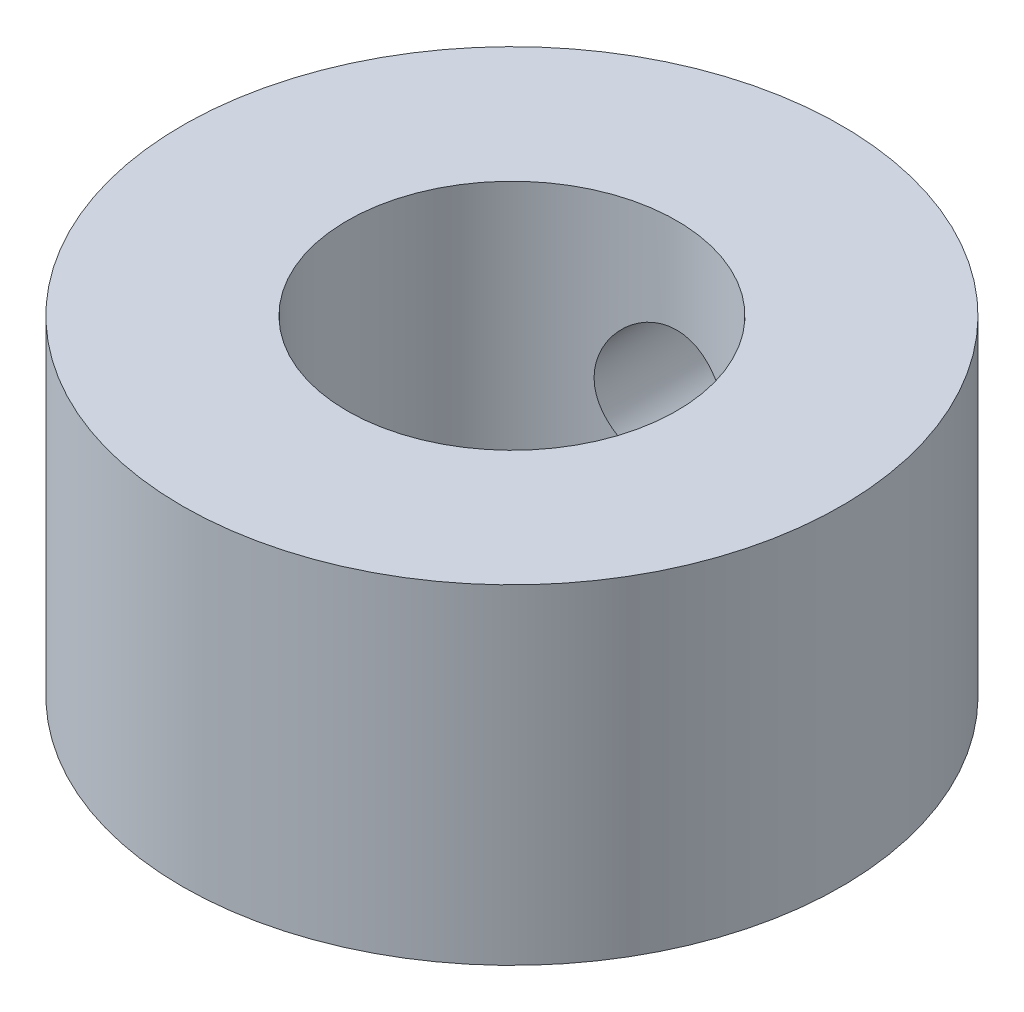
ISO-10303-21;
HEADER;
FILE_DESCRIPTION(('STEP AP214'),'2;1');
FILE_NAME('part.step','',(''),(''),'','','');
FILE_SCHEMA(('AUTOMOTIVE_DESIGN { 1 0 10303 214 1 1 1 1 }'));
ENDSEC;
DATA;
#1=APPLICATION_CONTEXT('core data for automotive mechanical design processes');
#2=APPLICATION_PROTOCOL_DEFINITION('international standard','automotive_design',2000,#1);
#3=PRODUCT_CONTEXT('',#1,'mechanical');
#4=PRODUCT('Part','Part','',(#3));
#5=PRODUCT_RELATED_PRODUCT_CATEGORY('part','',(#4));
#6=PRODUCT_DEFINITION_FORMATION('','',#4);
#7=PRODUCT_DEFINITION_CONTEXT('part definition',#1,'design');
#8=PRODUCT_DEFINITION('design','',#6,#7);
#9=PRODUCT_DEFINITION_SHAPE('','',#8);
#10=(LENGTH_UNIT() NAMED_UNIT(*) SI_UNIT(.MILLI.,.METRE.));
#11=(NAMED_UNIT(*) PLANE_ANGLE_UNIT() SI_UNIT($,.RADIAN.));
#12=(NAMED_UNIT(*) SI_UNIT($,.STERADIAN.) SOLID_ANGLE_UNIT());
#13=UNCERTAINTY_MEASURE_WITH_UNIT(LENGTH_MEASURE(1.E-05),#10,'distance_accuracy_value','');
#14=(GEOMETRIC_REPRESENTATION_CONTEXT(3) GLOBAL_UNCERTAINTY_ASSIGNED_CONTEXT((#13)) GLOBAL_UNIT_ASSIGNED_CONTEXT((#10,
#11,#12)) REPRESENTATION_CONTEXT('',''));
#15=CARTESIAN_POINT('',(0.,0.,0.));
#16=DIRECTION('',(0.,0.,1.));
#17=DIRECTION('',(1.,0.,0.));
#18=AXIS2_PLACEMENT_3D('',#15,#16,#17);
#19=CARTESIAN_POINT('',(0.,0.,0.));
#20=DIRECTION('',(0.,1.,0.));
#21=DIRECTION('',(0.,0.,1.));
#22=AXIS2_PLACEMENT_3D('',#19,#20,#21);
#23=CYLINDRICAL_SURFACE('',#22,4.);
#24=CARTESIAN_POINT('',(0.,0.,0.));
#25=DIRECTION('',(0.,1.,0.));
#26=DIRECTION('',(0.,0.,1.));
#27=AXIS2_PLACEMENT_3D('',#24,#25,#26);
#28=CIRCLE('',#27,4.);
#29=CARTESIAN_POINT('',(0.,0.,4.));
#30=VERTEX_POINT('',#29);
#31=EDGE_CURVE('E38',#30,#30,#28,.F.);
#32=ORIENTED_EDGE('',*,*,#31,.T.);
#33=EDGE_LOOP('',(#32));
#34=FACE_BOUND('',#33,.T.);
#35=CARTESIAN_POINT('',(0.,8.,0.));
#36=DIRECTION('',(0.,1.,0.));
#37=DIRECTION('',(0.,0.,1.));
#38=AXIS2_PLACEMENT_3D('',#35,#36,#37);
#39=CIRCLE('',#38,4.);
#40=CARTESIAN_POINT('',(0.,8.,4.));
#41=VERTEX_POINT('',#40);
#42=EDGE_CURVE('E61',#41,#41,#39,.F.);
#43=ORIENTED_EDGE('',*,*,#42,.F.);
#44=EDGE_LOOP('',(#43));
#45=FACE_BOUND('',#44,.T.);
#46=CARTESIAN_POINT('',(-1.65,4.05034929513931,-3.64383040220041));
#47=CARTESIAN_POINT('',(-1.64999056813102,4.13844577536499,-3.64383945275153));
#48=CARTESIAN_POINT('',(-1.64289989177358,4.2266897271129,-3.64707173267573));
#49=CARTESIAN_POINT('',(-1.61480845546373,4.40063635621819,-3.65959209124688));
#50=CARTESIAN_POINT('',(-1.5937695789634,4.48633139573691,-3.66889676295874));
#51=CARTESIAN_POINT('',(-1.53873536249638,4.65235223326994,-3.69231325052125));
#52=CARTESIAN_POINT('',(-1.50479212400174,4.73269811535791,-3.70640571161012));
#53=CARTESIAN_POINT('',(-1.42506535594207,4.88653106197353,-3.73778230052357));
#54=CARTESIAN_POINT('',(-1.37928479159595,4.96001983792334,-3.75506562873473));
#55=CARTESIAN_POINT('',(-1.27419856290372,5.10257798298581,-3.7920553041855));
#56=CARTESIAN_POINT('',(-1.2142851824136,5.17117855091952,-3.81184277704779));
#57=CARTESIAN_POINT('',(-1.08391072165483,5.29770406704807,-3.85094363418238));
#58=CARTESIAN_POINT('',(-1.01344563996364,5.35562494661153,-3.87025683535296));
#59=CARTESIAN_POINT('',(-0.860301943593383,5.46152066644118,-3.90721575035942));
#60=CARTESIAN_POINT('',(-0.777232390113591,5.50897022784547,-3.92475616703248));
#61=CARTESIAN_POINT('',(-0.603436361875857,5.58901944046101,-3.95520283117798));
#62=CARTESIAN_POINT('',(-0.512713242513045,5.62162555948587,-3.96811109652272));
#63=CARTESIAN_POINT('',(-0.331105172304398,5.66937000179554,-3.98726403378776));
#64=CARTESIAN_POINT('',(-0.240465625184492,5.68531614306255,-3.99381564337609));
#65=CARTESIAN_POINT('',(-0.057576355149865,5.70189594699448,-4.0006306156112));
#66=CARTESIAN_POINT('',(0.0346727137709554,5.70253569046132,-4.00089647540932));
#67=CARTESIAN_POINT('',(0.212297380895985,5.68891279900272,-3.99529224160632));
#68=CARTESIAN_POINT('',(0.297754665400397,5.67553711142221,-3.98978733384658));
#69=CARTESIAN_POINT('',(0.465085845235279,5.63578047769155,-3.97375926025944));
#70=CARTESIAN_POINT('',(0.546959476205493,5.60939857384863,-3.96323572489496));
#71=CARTESIAN_POINT('',(0.70629560681723,5.54406163341913,-3.93798907731603));
#72=CARTESIAN_POINT('',(0.78367197976247,5.50492130521444,-3.92320447216362));
#73=CARTESIAN_POINT('',(0.930960489992467,5.41535801595271,-3.89088763760773));
#74=CARTESIAN_POINT('',(1.00086999453932,5.36493109463601,-3.87335444442336));
#75=CARTESIAN_POINT('',(1.13638530947041,5.25016105611068,-3.83587133640027));
#76=CARTESIAN_POINT('',(1.20135746318645,5.18509588424059,-3.8158381454309));
#77=CARTESIAN_POINT('',(1.31973838423493,5.04493962881774,-3.77653142784555));
#78=CARTESIAN_POINT('',(1.37314286572202,4.96984484587601,-3.75725818494773));
#79=CARTESIAN_POINT('',(1.46845339844828,4.808750891592,-3.72106607156909));
#80=CARTESIAN_POINT('',(1.50994179309277,4.72248172344666,-3.70424107982558));
#81=CARTESIAN_POINT('',(1.57754508127096,4.54330262373342,-3.67596385006485));
#82=CARTESIAN_POINT('',(1.60367071206121,4.4503973812655,-3.66450786071417));
#83=CARTESIAN_POINT('',(1.63821320355942,4.26692639995433,-3.64919091711418));
#84=CARTESIAN_POINT('',(1.64765569454682,4.17659099395645,-3.64489111171831));
#85=CARTESIAN_POINT('',(1.65157101672826,3.99554366544071,-3.64311980380967));
#86=CARTESIAN_POINT('',(1.64604885780402,3.90483187908003,-3.64564601607449));
#87=CARTESIAN_POINT('',(1.62112710501827,3.73154828608984,-3.65678944366161));
#88=CARTESIAN_POINT('',(1.60261202118543,3.6488211154647,-3.66501803861664));
#89=CARTESIAN_POINT('',(1.55339580262015,3.48771223075934,-3.68614612916707));
#90=CARTESIAN_POINT('',(1.52269185697123,3.40933152378765,-3.69904670212356));
#91=CARTESIAN_POINT('',(1.44853902204985,3.25547028944367,-3.72872477858182));
#92=CARTESIAN_POINT('',(1.40460979308264,3.18024910036007,-3.74564214050945));
#93=CARTESIAN_POINT('',(1.30573455409451,3.03788912570958,-3.78124523189864));
#94=CARTESIAN_POINT('',(1.25078384473684,2.97075380740419,-3.79993171387674));
#95=CARTESIAN_POINT('',(1.12627542162099,2.8409196686926,-3.83876011670653));
#96=CARTESIAN_POINT('',(1.05590387126704,2.77899755809059,-3.85889967217623));
#97=CARTESIAN_POINT('',(0.905297980080105,2.66770643947724,-3.89698114804694));
#98=CARTESIAN_POINT('',(0.825063002026906,2.61833824313611,-3.91492292631236));
#99=CARTESIAN_POINT('',(0.65651681688327,2.53364516093252,-3.94668767391886));
#100=CARTESIAN_POINT('',(0.568191273870494,2.49834582013658,-3.96050313975064));
#101=CARTESIAN_POINT('',(0.386140833605179,2.44335763828056,-3.98237104121022));
#102=CARTESIAN_POINT('',(0.292419112817563,2.42365971220037,-3.9904268305481));
#103=CARTESIAN_POINT('',(0.109187189544838,2.40156106621883,-3.9994889299446));
#104=CARTESIAN_POINT('',(0.019830308118638,2.39806446639737,-4.00094173424749));
#105=CARTESIAN_POINT('',(-0.158161739195409,2.40553472950959,-3.99786220239438));
#106=CARTESIAN_POINT('',(-0.246797024648477,2.41649914513476,-3.99333087896147));
#107=CARTESIAN_POINT('',(-0.417705375935874,2.45179393727487,-3.979024148364));
#108=CARTESIAN_POINT('',(-0.500092371627849,2.47565373725386,-3.96943363922013));
#109=CARTESIAN_POINT('',(-0.659667355734158,2.5355534100193,-3.94605480923816));
#110=CARTESIAN_POINT('',(-0.736854343148742,2.57159561992599,-3.93226568297163));
#111=CARTESIAN_POINT('',(-0.887661133732617,2.6566538218257,-3.90105808483759));
#112=CARTESIAN_POINT('',(-0.960964214361148,2.70618055191224,-3.8835042391169));
#113=CARTESIAN_POINT('',(-1.09852932170704,2.81605214192931,-3.84685709666619));
#114=CARTESIAN_POINT('',(-1.1627880603165,2.87640091822012,-3.82776324400832));
#115=CARTESIAN_POINT('',(-1.28487769945047,3.01093682249397,-3.78859741195738));
#116=CARTESIAN_POINT('',(-1.34199767947157,3.08577705202425,-3.76854475207571));
#117=CARTESIAN_POINT('',(-1.4429647467733,3.24461527082037,-3.73105419200534));
#118=CARTESIAN_POINT('',(-1.48680449811903,3.3286182868489,-3.7136177396712));
#119=CARTESIAN_POINT('',(-1.55944447766651,3.5030777364092,-3.68370387904713));
#120=CARTESIAN_POINT('',(-1.58834112875234,3.5934884032304,-3.67119480418034));
#121=CARTESIAN_POINT('',(-1.63017263567573,3.77839643921767,-3.65281837075147));
#122=CARTESIAN_POINT('',(-1.64316103312974,3.87287898601618,-3.64692873900432));
#123=CARTESIAN_POINT('',(-1.6493120932942,3.99521260878195,-3.64414054419779));
#124=CARTESIAN_POINT('',(-1.6500029523216,4.02277372742433,-3.64382756923722));
#125=CARTESIAN_POINT('',(-1.65,4.05034929513931,-3.64383040220041));
#126=B_SPLINE_CURVE_WITH_KNOTS('',3,(#46,#47,#48,#49,#50,#51,#52,#53,#54,#55,#56,#57,#58,#59,
#60,#61,#62,#63,#64,#65,#66,#67,#68,#69,#70,#71,#72,#73,#74,#75,#76,#77,#78,#79,#80,#81,#82,#83,
#84,#85,#86,#87,#88,#89,#90,#91,#92,#93,#94,#95,#96,#97,#98,#99,#100,#101,#102,#103,#104,#105,
#106,#107,#108,#109,#110,#111,#112,#113,#114,#115,#116,#117,#118,#119,#120,#121,#122,#123,#124,
#125),.UNSPECIFIED.,.T.,.F.,(4,2,2,2,2,2,2,2,2,2,2,2,2,2,2,2,2,2,2,2,2,2,2,2,2,2,2,2,2,2,2,2,2,
2,2,2,2,2,2,4),(0.,0.264211724660745,0.529148459018597,0.793026677872049,1.05683885985756,
1.33523297260792,1.61373292676209,1.90403076094908,2.19420198072699,2.4695381624427,
2.74476495901024,3.00356896819766,3.26239203686791,3.5251552692474,3.78801084539546,
4.06907613148065,4.35024537535724,4.64031806272423,4.9301877724111,5.20152035698263,
5.47276211576042,5.72713321026166,5.98156300028881,6.24665916965708,6.51186861189123,
6.79815687284347,7.08446363898863,7.37128791456171,7.65794504349151,7.92489841526079,
8.19180661499935,8.44957452423759,8.70739191275388,8.97680852354695,9.24632283025307,
9.53374725602175,9.82133016535516,10.1070334851925,10.3917725616094,10.4744749384332),.UNSPECIFIED.);
#127=CARTESIAN_POINT('',(-1.65,4.05034929513931,-3.64383040220041));
#128=VERTEX_POINT('',#127);
#129=EDGE_CURVE('E19',#128,#128,#126,.T.);
#130=ORIENTED_EDGE('',*,*,#129,.T.);
#131=EDGE_LOOP('',(#130));
#132=FACE_BOUND('',#131,.T.);
#133=ADVANCED_FACE('F15',(#34,#45,#132),#23,.F.);
#134=CARTESIAN_POINT('',(0.,4.05034929513931,0.));
#135=DIRECTION('',(0.,0.,-1.));
#136=DIRECTION('',(-1.,0.,0.));
#137=AXIS2_PLACEMENT_3D('',#134,#135,#136);
#138=CYLINDRICAL_SURFACE('',#137,1.65);
#139=CARTESIAN_POINT('',(0.,2.40034929513931,-8.));
#140=CARTESIAN_POINT('',(0.0915439977194359,2.4003537213623,-7.99999779978433));
#141=CARTESIAN_POINT('',(0.183200947352936,2.40800066708128,-7.99841107252887));
#142=CARTESIAN_POINT('',(0.363994417511513,2.43838120211179,-7.99222923227339));
#143=CARTESIAN_POINT('',(0.453125616169154,2.46114448719231,-7.98762819796266));
#144=CARTESIAN_POINT('',(0.626116900024874,2.52102309914314,-7.97593141787326));
#145=CARTESIAN_POINT('',(0.70998442456681,2.55811761478248,-7.96883929090859));
#146=CARTESIAN_POINT('',(0.8702747260991,2.64555128715277,-7.95293137099705));
#147=CARTESIAN_POINT('',(0.946699892831718,2.69588617305628,-7.94411613409343));
#148=CARTESIAN_POINT('',(1.09107632547974,2.80914882998827,-7.92558673482749));
#149=CARTESIAN_POINT('',(1.15890476062766,2.87223153671512,-7.91586239195313));
#150=CARTESIAN_POINT('',(1.28309960241808,3.0088691865589,-7.89668372497188));
#151=CARTESIAN_POINT('',(1.33946446153949,3.08242554128638,-7.88722943746887));
#152=CARTESIAN_POINT('',(1.43965129898853,3.23880224001227,-7.8695632567784));
#153=CARTESIAN_POINT('',(1.48334628771865,3.32170553544658,-7.86136430649061));
#154=CARTESIAN_POINT('',(1.55613862377608,3.49387381003635,-7.84728081275986));
#155=CARTESIAN_POINT('',(1.58523763301677,3.58313806360411,-7.84139600584263));
#156=CARTESIAN_POINT('',(1.62761487742027,3.76418117705944,-7.83270935001779));
#157=CARTESIAN_POINT('',(1.64110742104017,3.85590782987823,-7.82986578073518));
#158=CARTESIAN_POINT('',(1.65255461081871,4.04036370668953,-7.82745807911903));
#159=CARTESIAN_POINT('',(1.65051092574399,4.13309282193783,-7.82789359457465));
#160=CARTESIAN_POINT('',(1.63111671998855,4.31534438134103,-7.83195698489573));
#161=CARTESIAN_POINT('',(1.61401305884071,4.40489441499811,-7.83553337288329));
#162=CARTESIAN_POINT('',(1.56537430781473,4.57982678409925,-7.84539440531208));
#163=CARTESIAN_POINT('',(1.53383838131893,4.66520887761623,-7.8516792067549));
#164=CARTESIAN_POINT('',(1.45699639746596,4.83008921203399,-7.86630117532804));
#165=CARTESIAN_POINT('',(1.4115930258329,4.90954076758502,-7.87465276483293));
#166=CARTESIAN_POINT('',(1.30837707771353,5.0597836910713,-7.89245739029285));
#167=CARTESIAN_POINT('',(1.25056389142055,5.13057463316364,-7.90191048036414));
#168=CARTESIAN_POINT('',(1.1228637145769,5.26290488281187,-7.9210741478372));
#169=CARTESIAN_POINT('',(1.0527683509847,5.32424304559648,-7.93078620656451));
#170=CARTESIAN_POINT('',(0.903144735227602,5.43435019996824,-7.94921391906926));
#171=CARTESIAN_POINT('',(0.82361237513073,5.48311368826455,-7.95792913565464));
#172=CARTESIAN_POINT('',(0.657120132565352,5.56672567843572,-7.97340575124722));
#173=CARTESIAN_POINT('',(0.570142081505184,5.60153889294184,-7.98016218371275));
#174=CARTESIAN_POINT('',(0.391512092368623,5.65593358150612,-7.99091233909096));
#175=CARTESIAN_POINT('',(0.299870391071079,5.67554700256282,-7.99491185453733));
#176=CARTESIAN_POINT('',(0.172937108514817,5.69162892639528,-7.9982053102901));
#177=CARTESIAN_POINT('',(0.138438791509327,5.69489621896845,-7.99887679372199));
#178=CARTESIAN_POINT('',(0.0692990462852674,5.69925724283163,-7.99977455540032));
#179=CARTESIAN_POINT('',(0.0346576178521489,5.7003509708619,-8.00000083297907));
#180=CARTESIAN_POINT('',(-0.091543997719434,5.70034486891633,-7.99999779978433));
#181=CARTESIAN_POINT('',(-0.183200947352934,5.69269792319734,-7.99841107252887));
#182=CARTESIAN_POINT('',(-0.363994417511511,5.66231738816682,-7.99222923227339));
#183=CARTESIAN_POINT('',(-0.453125616169153,5.63955410308631,-7.98762819796266));
#184=CARTESIAN_POINT('',(-0.626116900024874,5.57967549113548,-7.97593141787326));
#185=CARTESIAN_POINT('',(-0.709984424566809,5.54258097549614,-7.96883929090859));
#186=CARTESIAN_POINT('',(-0.870274726099099,5.45514730312585,-7.95293137099705));
#187=CARTESIAN_POINT('',(-0.946699892831718,5.40481241722234,-7.94411613409343));
#188=CARTESIAN_POINT('',(-1.09107632547974,5.29154976029035,-7.92558673482749));
#189=CARTESIAN_POINT('',(-1.15890476062766,5.2284670535635,-7.91586239195313));
#190=CARTESIAN_POINT('',(-1.28309960241808,5.09182940371972,-7.89668372497188));
#191=CARTESIAN_POINT('',(-1.33946446153949,5.01827304899224,-7.88722943746887));
#192=CARTESIAN_POINT('',(-1.43965129898853,4.86189635026635,-7.8695632567784));
#193=CARTESIAN_POINT('',(-1.48334628771865,4.77899305483204,-7.86136430649061));
#194=CARTESIAN_POINT('',(-1.55613862377608,4.60682478024227,-7.84728081275986));
#195=CARTESIAN_POINT('',(-1.58523763301677,4.51756052667451,-7.84139600584263));
#196=CARTESIAN_POINT('',(-1.62761487742027,4.33651741321918,-7.83270935001779));
#197=CARTESIAN_POINT('',(-1.64110742104017,4.24479076040039,-7.82986578073518));
#198=CARTESIAN_POINT('',(-1.65255461081871,4.06033488358909,-7.82745807911903));
#199=CARTESIAN_POINT('',(-1.65051092574399,3.96760576834079,-7.82789359457465));
#200=CARTESIAN_POINT('',(-1.63111671998855,3.78535420893759,-7.83195698489573));
#201=CARTESIAN_POINT('',(-1.61401305884071,3.69580417528051,-7.83553337288329));
#202=CARTESIAN_POINT('',(-1.56537430781473,3.52087180617937,-7.84539440531208));
#203=CARTESIAN_POINT('',(-1.53383838131894,3.43548971266239,-7.8516792067549));
#204=CARTESIAN_POINT('',(-1.45699639746596,3.27060937824463,-7.86630117532804));
#205=CARTESIAN_POINT('',(-1.4115930258329,3.1911578226936,-7.87465276483293));
#206=CARTESIAN_POINT('',(-1.30837707771353,3.04091489920732,-7.89245739029285));
#207=CARTESIAN_POINT('',(-1.25056389142055,2.97012395711498,-7.90191048036414));
#208=CARTESIAN_POINT('',(-1.1228637145769,2.83779370746675,-7.9210741478372));
#209=CARTESIAN_POINT('',(-1.0527683509847,2.77645554468214,-7.93078620656451));
#210=CARTESIAN_POINT('',(-0.903144735227602,2.66634839031038,-7.94921391906926));
#211=CARTESIAN_POINT('',(-0.82361237513073,2.61758490201407,-7.95792913565464));
#212=CARTESIAN_POINT('',(-0.657120132565352,2.5339729118429,-7.97340575124722));
#213=CARTESIAN_POINT('',(-0.570142081505184,2.49915969733678,-7.98016218371275));
#214=CARTESIAN_POINT('',(-0.391512092368623,2.4447650087725,-7.99091233909096));
#215=CARTESIAN_POINT('',(-0.299870391071078,2.4251515877158,-7.99491185453733));
#216=CARTESIAN_POINT('',(-0.172937108514816,2.40906966388334,-7.9982053102901));
#217=CARTESIAN_POINT('',(-0.138438791509326,2.40580237131017,-7.99887679372199));
#218=CARTESIAN_POINT('',(-0.0692990462852663,2.40144134744699,-7.99977455540032));
#219=CARTESIAN_POINT('',(-0.0346576178521475,2.40034761941672,-8.00000083297907));
#220=CARTESIAN_POINT('',(0.,2.40034929513931,-8.));
#221=B_SPLINE_CURVE_WITH_KNOTS('',3,(#139,#140,#141,#142,#143,#144,#145,#146,#147,#148,#149,
#150,#151,#152,#153,#154,#155,#156,#157,#158,#159,#160,#161,#162,#163,#164,#165,#166,#167,#168,
#169,#170,#171,#172,#173,#174,#175,#176,#177,#178,#179,#180,#181,#182,#183,#184,#185,#186,#187,
#188,#189,#190,#191,#192,#193,#194,#195,#196,#197,#198,#199,#200,#201,#202,#203,#204,#205,#206,
#207,#208,#209,#210,#211,#212,#213,#214,#215,#216,#217,#218,#219,#220),.UNSPECIFIED.,.T.,.F.,(4,
2,2,2,2,2,2,2,2,2,2,2,2,2,2,2,2,2,2,2,2,2,2,2,2,2,2,2,2,2,2,2,2,2,2,2,2,2,2,2,4),(0.,
0.274499448897666,0.549539748456777,0.824182137868905,1.09873604675135,1.37685270427307,
1.65500688116403,1.93585956732545,2.21668026804534,2.49359715103096,2.77048429043228,
3.04291553293099,3.31536256987771,3.58976721864358,3.8641853544851,4.14381302660947,
4.42356287053658,4.70401594428934,4.98387794960991,5.08780046741561,5.19172314107552,
5.46622258997319,5.7412628895323,6.01590527894443,6.29045918782688,6.5685758453486,
6.84673002223955,7.12758270840097,7.40840340912086,7.68532029210648,7.9622074315078,
8.23463867400651,8.50708571095323,8.7814903597191,9.05590849556063,9.33553616768499,
9.61528601161211,9.89573908536486,10.1756010906854,10.2795236084911,10.383446282151),.UNSPECIFIED.);
#222=CARTESIAN_POINT('',(0.,2.40034929513931,-8.));
#223=VERTEX_POINT('',#222);
#224=EDGE_CURVE('E30',#223,#223,#221,.T.);
#225=ORIENTED_EDGE('',*,*,#224,.F.);
#226=EDGE_LOOP('',(#225));
#227=FACE_BOUND('',#226,.T.);
#228=ORIENTED_EDGE('',*,*,#129,.F.);
#229=EDGE_LOOP('',(#228));
#230=FACE_BOUND('',#229,.T.);
#231=ADVANCED_FACE('F39',(#227,#230),#138,.F.);
#232=CARTESIAN_POINT('',(0.,8.,0.));
#233=DIRECTION('',(0.,1.,0.));
#234=DIRECTION('',(0.,0.,1.));
#235=AXIS2_PLACEMENT_3D('',#232,#233,#234);
#236=PLANE('',#235);
#237=CARTESIAN_POINT('',(0.,8.,0.));
#238=DIRECTION('',(0.,1.,0.));
#239=DIRECTION('',(0.,0.,1.));
#240=AXIS2_PLACEMENT_3D('',#237,#238,#239);
#241=CIRCLE('',#240,8.);
#242=CARTESIAN_POINT('',(0.,8.,8.));
#243=VERTEX_POINT('',#242);
#244=EDGE_CURVE('E25',#243,#243,#241,.F.);
#245=ORIENTED_EDGE('',*,*,#244,.F.);
#246=EDGE_LOOP('',(#245));
#247=FACE_BOUND('',#246,.T.);
#248=ORIENTED_EDGE('',*,*,#42,.T.);
#249=EDGE_LOOP('',(#248));
#250=FACE_BOUND('',#249,.T.);
#251=ADVANCED_FACE('F48',(#247,#250),#236,.T.);
#252=CARTESIAN_POINT('',(0.,0.,0.));
#253=DIRECTION('',(0.,1.,0.));
#254=DIRECTION('',(0.,0.,1.));
#255=AXIS2_PLACEMENT_3D('',#252,#253,#254);
#256=PLANE('',#255);
#257=CARTESIAN_POINT('',(0.,0.,0.));
#258=DIRECTION('',(0.,1.,0.));
#259=DIRECTION('',(0.,0.,1.));
#260=AXIS2_PLACEMENT_3D('',#257,#258,#259);
#261=CIRCLE('',#260,8.);
#262=CARTESIAN_POINT('',(0.,0.,8.));
#263=VERTEX_POINT('',#262);
#264=EDGE_CURVE('E10',#263,#263,#261,.T.);
#265=ORIENTED_EDGE('',*,*,#264,.F.);
#266=EDGE_LOOP('',(#265));
#267=FACE_BOUND('',#266,.T.);
#268=ORIENTED_EDGE('',*,*,#31,.F.);
#269=EDGE_LOOP('',(#268));
#270=FACE_BOUND('',#269,.T.);
#271=ADVANCED_FACE('F46',(#267,#270),#256,.F.);
#272=CARTESIAN_POINT('',(0.,0.,0.));
#273=DIRECTION('',(0.,1.,0.));
#274=DIRECTION('',(0.,0.,1.));
#275=AXIS2_PLACEMENT_3D('',#272,#273,#274);
#276=CYLINDRICAL_SURFACE('',#275,8.);
#277=ORIENTED_EDGE('',*,*,#264,.T.);
#278=EDGE_LOOP('',(#277));
#279=FACE_BOUND('',#278,.T.);
#280=ORIENTED_EDGE('',*,*,#244,.T.);
#281=EDGE_LOOP('',(#280));
#282=FACE_BOUND('',#281,.T.);
#283=ORIENTED_EDGE('',*,*,#224,.T.);
#284=EDGE_LOOP('',(#283));
#285=FACE_BOUND('',#284,.T.);
#286=ADVANCED_FACE('F42',(#279,#282,#285),#276,.T.);
#287=CLOSED_SHELL('',(#133,#231,#251,#271,#286));
#288=MANIFOLD_SOLID_BREP('B1',#287);
#289=ADVANCED_BREP_SHAPE_REPRESENTATION('',(#18,#288),#14);
#290=SHAPE_DEFINITION_REPRESENTATION(#9,#289);
ENDSEC;
END-ISO-10303-21;
